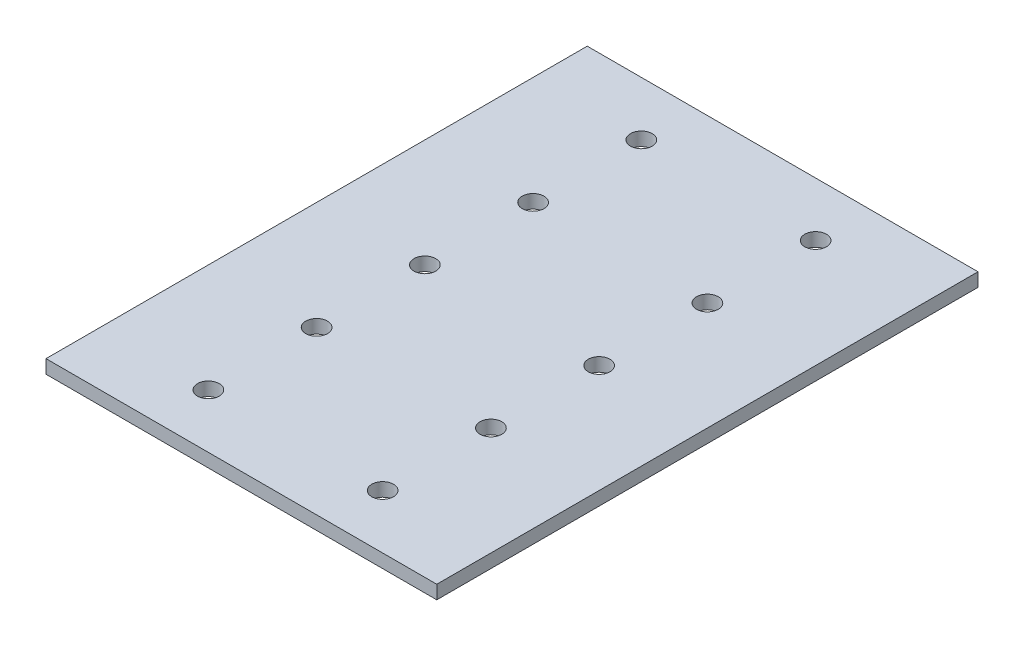
ISO-10303-21;
HEADER;
FILE_DESCRIPTION(('STEP AP214'),'2;1');
FILE_NAME('part.step','',(''),(''),'','','');
FILE_SCHEMA(('AUTOMOTIVE_DESIGN { 1 0 10303 214 1 1 1 1 }'));
ENDSEC;
DATA;
#1=APPLICATION_CONTEXT('core data for automotive mechanical design processes');
#2=APPLICATION_PROTOCOL_DEFINITION('international standard','automotive_design',2000,#1);
#3=PRODUCT_CONTEXT('',#1,'mechanical');
#4=PRODUCT('Part','Part','',(#3));
#5=PRODUCT_RELATED_PRODUCT_CATEGORY('part','',(#4));
#6=PRODUCT_DEFINITION_FORMATION('','',#4);
#7=PRODUCT_DEFINITION_CONTEXT('part definition',#1,'design');
#8=PRODUCT_DEFINITION('design','',#6,#7);
#9=PRODUCT_DEFINITION_SHAPE('','',#8);
#10=(LENGTH_UNIT() NAMED_UNIT(*) SI_UNIT(.MILLI.,.METRE.));
#11=(NAMED_UNIT(*) PLANE_ANGLE_UNIT() SI_UNIT($,.RADIAN.));
#12=(NAMED_UNIT(*) SI_UNIT($,.STERADIAN.) SOLID_ANGLE_UNIT());
#13=UNCERTAINTY_MEASURE_WITH_UNIT(LENGTH_MEASURE(1.E-05),#10,'distance_accuracy_value','');
#14=(GEOMETRIC_REPRESENTATION_CONTEXT(3) GLOBAL_UNCERTAINTY_ASSIGNED_CONTEXT((#13)) GLOBAL_UNIT_ASSIGNED_CONTEXT((#10,
#11,#12)) REPRESENTATION_CONTEXT('',''));
#15=CARTESIAN_POINT('',(0.,0.,0.));
#16=DIRECTION('',(0.,0.,1.));
#17=DIRECTION('',(1.,0.,0.));
#18=AXIS2_PLACEMENT_3D('',#15,#16,#17);
#19=CARTESIAN_POINT('',(66.294,0.,-114.3));
#20=DIRECTION('',(0.,1.,0.));
#21=DIRECTION('',(0.,0.,1.));
#22=AXIS2_PLACEMENT_3D('',#19,#20,#21);
#23=CYLINDRICAL_SURFACE('',#22,2.55270000000001);
#24=CARTESIAN_POINT('',(66.294,0.,-114.3));
#25=DIRECTION('',(0.,1.,0.));
#26=DIRECTION('',(0.,0.,1.));
#27=AXIS2_PLACEMENT_3D('',#24,#25,#26);
#28=CIRCLE('',#27,2.55270000000001);
#29=CARTESIAN_POINT('',(66.294,0.,-111.7473));
#30=VERTEX_POINT('',#29);
#31=EDGE_CURVE('E47',#30,#30,#28,.T.);
#32=ORIENTED_EDGE('',*,*,#31,.F.);
#33=EDGE_LOOP('',(#32));
#34=FACE_BOUND('',#33,.T.);
#35=CARTESIAN_POINT('',(66.294,3.175,-114.3));
#36=DIRECTION('',(0.,1.,0.));
#37=DIRECTION('',(0.,0.,1.));
#38=AXIS2_PLACEMENT_3D('',#35,#36,#37);
#39=CIRCLE('',#38,2.55270000000001);
#40=CARTESIAN_POINT('',(66.294,3.175,-111.7473));
#41=VERTEX_POINT('',#40);
#42=EDGE_CURVE('E11',#41,#41,#39,.T.);
#43=ORIENTED_EDGE('',*,*,#42,.T.);
#44=EDGE_LOOP('',(#43));
#45=FACE_BOUND('',#44,.T.);
#46=ADVANCED_FACE('F39',(#34,#45),#23,.F.);
#47=CARTESIAN_POINT('',(66.294,0.,-88.9));
#48=DIRECTION('',(0.,1.,0.));
#49=DIRECTION('',(0.,0.,1.));
#50=AXIS2_PLACEMENT_3D('',#47,#48,#49);
#51=CYLINDRICAL_SURFACE('',#50,2.55270000000001);
#52=CARTESIAN_POINT('',(66.294,0.,-88.9));
#53=DIRECTION('',(0.,1.,0.));
#54=DIRECTION('',(0.,0.,1.));
#55=AXIS2_PLACEMENT_3D('',#52,#53,#54);
#56=CIRCLE('',#55,2.55270000000001);
#57=CARTESIAN_POINT('',(66.294,0.,-86.3473));
#58=VERTEX_POINT('',#57);
#59=EDGE_CURVE('E141',#58,#58,#56,.T.);
#60=ORIENTED_EDGE('',*,*,#59,.F.);
#61=EDGE_LOOP('',(#60));
#62=FACE_BOUND('',#61,.T.);
#63=CARTESIAN_POINT('',(66.294,3.175,-88.9));
#64=DIRECTION('',(0.,1.,0.));
#65=DIRECTION('',(0.,0.,1.));
#66=AXIS2_PLACEMENT_3D('',#63,#64,#65);
#67=CIRCLE('',#66,2.55270000000001);
#68=CARTESIAN_POINT('',(66.294,3.175,-86.3473));
#69=VERTEX_POINT('',#68);
#70=EDGE_CURVE('E144',#69,#69,#67,.T.);
#71=ORIENTED_EDGE('',*,*,#70,.T.);
#72=EDGE_LOOP('',(#71));
#73=FACE_BOUND('',#72,.T.);
#74=ADVANCED_FACE('F153',(#62,#73),#51,.F.);
#75=CARTESIAN_POINT('',(66.294,0.,-63.5));
#76=DIRECTION('',(0.,1.,0.));
#77=DIRECTION('',(0.,0.,1.));
#78=AXIS2_PLACEMENT_3D('',#75,#76,#77);
#79=CYLINDRICAL_SURFACE('',#78,2.55270000000001);
#80=CARTESIAN_POINT('',(66.294,0.,-63.5));
#81=DIRECTION('',(0.,1.,0.));
#82=DIRECTION('',(0.,0.,1.));
#83=AXIS2_PLACEMENT_3D('',#80,#81,#82);
#84=CIRCLE('',#83,2.55270000000001);
#85=CARTESIAN_POINT('',(66.294,0.,-60.9473));
#86=VERTEX_POINT('',#85);
#87=EDGE_CURVE('E135',#86,#86,#84,.T.);
#88=ORIENTED_EDGE('',*,*,#87,.F.);
#89=EDGE_LOOP('',(#88));
#90=FACE_BOUND('',#89,.T.);
#91=CARTESIAN_POINT('',(66.294,3.175,-63.5));
#92=DIRECTION('',(0.,1.,0.));
#93=DIRECTION('',(0.,0.,1.));
#94=AXIS2_PLACEMENT_3D('',#91,#92,#93);
#95=CIRCLE('',#94,2.55270000000001);
#96=CARTESIAN_POINT('',(66.294,3.175,-60.9473));
#97=VERTEX_POINT('',#96);
#98=EDGE_CURVE('E138',#97,#97,#95,.T.);
#99=ORIENTED_EDGE('',*,*,#98,.T.);
#100=EDGE_LOOP('',(#99));
#101=FACE_BOUND('',#100,.T.);
#102=ADVANCED_FACE('F192',(#90,#101),#79,.F.);
#103=CARTESIAN_POINT('',(25.4,0.,-114.3));
#104=DIRECTION('',(0.,1.,0.));
#105=DIRECTION('',(0.,0.,1.));
#106=AXIS2_PLACEMENT_3D('',#103,#104,#105);
#107=CYLINDRICAL_SURFACE('',#106,2.55269999999993);
#108=CARTESIAN_POINT('',(25.4,0.,-114.3));
#109=DIRECTION('',(0.,1.,0.));
#110=DIRECTION('',(0.,0.,1.));
#111=AXIS2_PLACEMENT_3D('',#108,#109,#110);
#112=CIRCLE('',#111,2.55269999999993);
#113=CARTESIAN_POINT('',(25.4,0.,-111.7473));
#114=VERTEX_POINT('',#113);
#115=EDGE_CURVE('E129',#114,#114,#112,.T.);
#116=ORIENTED_EDGE('',*,*,#115,.F.);
#117=EDGE_LOOP('',(#116));
#118=FACE_BOUND('',#117,.T.);
#119=CARTESIAN_POINT('',(25.4,3.175,-114.3));
#120=DIRECTION('',(0.,1.,0.));
#121=DIRECTION('',(0.,0.,1.));
#122=AXIS2_PLACEMENT_3D('',#119,#120,#121);
#123=CIRCLE('',#122,2.55269999999993);
#124=CARTESIAN_POINT('',(25.4,3.175,-111.7473));
#125=VERTEX_POINT('',#124);
#126=EDGE_CURVE('E132',#125,#125,#123,.T.);
#127=ORIENTED_EDGE('',*,*,#126,.T.);
#128=EDGE_LOOP('',(#127));
#129=FACE_BOUND('',#128,.T.);
#130=ADVANCED_FACE('F188',(#118,#129),#107,.F.);
#131=CARTESIAN_POINT('',(25.4,0.,-88.9));
#132=DIRECTION('',(0.,1.,0.));
#133=DIRECTION('',(0.,0.,1.));
#134=AXIS2_PLACEMENT_3D('',#131,#132,#133);
#135=CYLINDRICAL_SURFACE('',#134,2.55269999999993);
#136=CARTESIAN_POINT('',(25.4,0.,-88.9));
#137=DIRECTION('',(0.,1.,0.));
#138=DIRECTION('',(0.,0.,1.));
#139=AXIS2_PLACEMENT_3D('',#136,#137,#138);
#140=CIRCLE('',#139,2.55269999999993);
#141=CARTESIAN_POINT('',(25.4,0.,-86.3473000000001));
#142=VERTEX_POINT('',#141);
#143=EDGE_CURVE('E123',#142,#142,#140,.T.);
#144=ORIENTED_EDGE('',*,*,#143,.F.);
#145=EDGE_LOOP('',(#144));
#146=FACE_BOUND('',#145,.T.);
#147=CARTESIAN_POINT('',(25.4,3.175,-88.9));
#148=DIRECTION('',(0.,1.,0.));
#149=DIRECTION('',(0.,0.,1.));
#150=AXIS2_PLACEMENT_3D('',#147,#148,#149);
#151=CIRCLE('',#150,2.55269999999993);
#152=CARTESIAN_POINT('',(25.4,3.175,-86.3473000000001));
#153=VERTEX_POINT('',#152);
#154=EDGE_CURVE('E126',#153,#153,#151,.T.);
#155=ORIENTED_EDGE('',*,*,#154,.T.);
#156=EDGE_LOOP('',(#155));
#157=FACE_BOUND('',#156,.T.);
#158=ADVANCED_FACE('F184',(#146,#157),#135,.F.);
#159=CARTESIAN_POINT('',(25.4,0.,-63.5));
#160=DIRECTION('',(0.,1.,0.));
#161=DIRECTION('',(0.,0.,1.));
#162=AXIS2_PLACEMENT_3D('',#159,#160,#161);
#163=CYLINDRICAL_SURFACE('',#162,2.55269999999993);
#164=CARTESIAN_POINT('',(25.4,0.,-63.5));
#165=DIRECTION('',(0.,1.,0.));
#166=DIRECTION('',(0.,0.,1.));
#167=AXIS2_PLACEMENT_3D('',#164,#165,#166);
#168=CIRCLE('',#167,2.55269999999993);
#169=CARTESIAN_POINT('',(25.4,0.,-60.9473000000001));
#170=VERTEX_POINT('',#169);
#171=EDGE_CURVE('E117',#170,#170,#168,.T.);
#172=ORIENTED_EDGE('',*,*,#171,.F.);
#173=EDGE_LOOP('',(#172));
#174=FACE_BOUND('',#173,.T.);
#175=CARTESIAN_POINT('',(25.4,3.175,-63.5));
#176=DIRECTION('',(0.,1.,0.));
#177=DIRECTION('',(0.,0.,1.));
#178=AXIS2_PLACEMENT_3D('',#175,#176,#177);
#179=CIRCLE('',#178,2.55269999999993);
#180=CARTESIAN_POINT('',(25.4,3.175,-60.9473000000001));
#181=VERTEX_POINT('',#180);
#182=EDGE_CURVE('E120',#181,#181,#179,.T.);
#183=ORIENTED_EDGE('',*,*,#182,.T.);
#184=EDGE_LOOP('',(#183));
#185=FACE_BOUND('',#184,.T.);
#186=ADVANCED_FACE('F180',(#174,#185),#163,.F.);
#187=CARTESIAN_POINT('',(0.,3.175,0.));
#188=DIRECTION('',(1.,0.,0.));
#189=DIRECTION('',(0.,0.,-1.));
#190=AXIS2_PLACEMENT_3D('',#187,#188,#189);
#191=PLANE('',#190);
#192=DIRECTION('',(0.,0.,1.));
#193=VECTOR('',#192,1.);
#194=CARTESIAN_POINT('',(0.,0.,0.));
#195=LINE('',#194,#193);
#196=CARTESIAN_POINT('',(0.,0.,-127.));
#197=VERTEX_POINT('',#196);
#198=CARTESIAN_POINT('',(0.,0.,0.));
#199=VERTEX_POINT('',#198);
#200=EDGE_CURVE('E107',#197,#199,#195,.T.);
#201=ORIENTED_EDGE('',*,*,#200,.T.);
#202=DIRECTION('',(0.,-1.,0.));
#203=VECTOR('',#202,1.);
#204=CARTESIAN_POINT('',(0.,3.175,0.));
#205=LINE('',#204,#203);
#206=CARTESIAN_POINT('',(0.,3.175,0.));
#207=VERTEX_POINT('',#206);
#208=EDGE_CURVE('E98',#207,#199,#205,.T.);
#209=ORIENTED_EDGE('',*,*,#208,.F.);
#210=DIRECTION('',(0.,0.,1.));
#211=VECTOR('',#210,1.);
#212=CARTESIAN_POINT('',(0.,3.175,0.));
#213=LINE('',#212,#211);
#214=CARTESIAN_POINT('',(0.,3.175,-127.));
#215=VERTEX_POINT('',#214);
#216=EDGE_CURVE('E92',#215,#207,#213,.T.);
#217=ORIENTED_EDGE('',*,*,#216,.F.);
#218=DIRECTION('',(0.,-1.,0.));
#219=VECTOR('',#218,1.);
#220=CARTESIAN_POINT('',(0.,3.175,-127.));
#221=LINE('',#220,#219);
#222=EDGE_CURVE('E103',#215,#197,#221,.T.);
#223=ORIENTED_EDGE('',*,*,#222,.T.);
#224=EDGE_LOOP('',(#201,#209,#217,#223));
#225=FACE_BOUND('',#224,.T.);
#226=ADVANCED_FACE('F177',(#225),#191,.F.);
#227=CARTESIAN_POINT('',(0.,3.175,0.));
#228=DIRECTION('',(0.,0.,-1.));
#229=DIRECTION('',(-1.,0.,0.));
#230=AXIS2_PLACEMENT_3D('',#227,#228,#229);
#231=PLANE('',#230);
#232=DIRECTION('',(1.,0.,0.));
#233=VECTOR('',#232,1.);
#234=CARTESIAN_POINT('',(0.,0.,0.));
#235=LINE('',#234,#233);
#236=CARTESIAN_POINT('',(91.694,0.,0.));
#237=VERTEX_POINT('',#236);
#238=EDGE_CURVE('E97',#199,#237,#235,.T.);
#239=ORIENTED_EDGE('',*,*,#238,.T.);
#240=DIRECTION('',(0.,-1.,0.));
#241=VECTOR('',#240,1.);
#242=CARTESIAN_POINT('',(91.694,3.175,0.));
#243=LINE('',#242,#241);
#244=CARTESIAN_POINT('',(91.694,3.175,0.));
#245=VERTEX_POINT('',#244);
#246=EDGE_CURVE('E95',#245,#237,#243,.T.);
#247=ORIENTED_EDGE('',*,*,#246,.F.);
#248=DIRECTION('',(1.,0.,0.));
#249=VECTOR('',#248,1.);
#250=CARTESIAN_POINT('',(0.,3.175,0.));
#251=LINE('',#250,#249);
#252=EDGE_CURVE('E86',#207,#245,#251,.T.);
#253=ORIENTED_EDGE('',*,*,#252,.F.);
#254=ORIENTED_EDGE('',*,*,#208,.T.);
#255=EDGE_LOOP('',(#239,#247,#253,#254));
#256=FACE_BOUND('',#255,.T.);
#257=ADVANCED_FACE('F96',(#256),#231,.F.);
#258=CARTESIAN_POINT('',(91.694,3.175,0.));
#259=DIRECTION('',(-1.,0.,0.));
#260=DIRECTION('',(0.,0.,1.));
#261=AXIS2_PLACEMENT_3D('',#258,#259,#260);
#262=PLANE('',#261);
#263=DIRECTION('',(0.,0.,-1.));
#264=VECTOR('',#263,1.);
#265=CARTESIAN_POINT('',(91.694,0.,0.));
#266=LINE('',#265,#264);
#267=CARTESIAN_POINT('',(91.694,0.,-127.));
#268=VERTEX_POINT('',#267);
#269=EDGE_CURVE('E72',#237,#268,#266,.T.);
#270=ORIENTED_EDGE('',*,*,#269,.T.);
#271=DIRECTION('',(0.,-1.,0.));
#272=VECTOR('',#271,1.);
#273=CARTESIAN_POINT('',(91.694,3.175,-127.));
#274=LINE('',#273,#272);
#275=CARTESIAN_POINT('',(91.694,3.175,-127.));
#276=VERTEX_POINT('',#275);
#277=EDGE_CURVE('E99',#276,#268,#274,.T.);
#278=ORIENTED_EDGE('',*,*,#277,.F.);
#279=DIRECTION('',(0.,0.,-1.));
#280=VECTOR('',#279,1.);
#281=CARTESIAN_POINT('',(91.694,3.175,0.));
#282=LINE('',#281,#280);
#283=EDGE_CURVE('E90',#245,#276,#282,.T.);
#284=ORIENTED_EDGE('',*,*,#283,.F.);
#285=ORIENTED_EDGE('',*,*,#246,.T.);
#286=EDGE_LOOP('',(#270,#278,#284,#285));
#287=FACE_BOUND('',#286,.T.);
#288=ADVANCED_FACE('F101',(#287),#262,.F.);
#289=CARTESIAN_POINT('',(0.,3.175,-127.));
#290=DIRECTION('',(0.,0.,1.));
#291=DIRECTION('',(1.,0.,0.));
#292=AXIS2_PLACEMENT_3D('',#289,#290,#291);
#293=PLANE('',#292);
#294=DIRECTION('',(-1.,0.,0.));
#295=VECTOR('',#294,1.);
#296=CARTESIAN_POINT('',(0.,0.,-127.));
#297=LINE('',#296,#295);
#298=EDGE_CURVE('E78',#268,#197,#297,.T.);
#299=ORIENTED_EDGE('',*,*,#298,.T.);
#300=ORIENTED_EDGE('',*,*,#222,.F.);
#301=DIRECTION('',(-1.,0.,0.));
#302=VECTOR('',#301,1.);
#303=CARTESIAN_POINT('',(0.,3.175,-127.));
#304=LINE('',#303,#302);
#305=EDGE_CURVE('E55',#276,#215,#304,.T.);
#306=ORIENTED_EDGE('',*,*,#305,.F.);
#307=ORIENTED_EDGE('',*,*,#277,.T.);
#308=EDGE_LOOP('',(#299,#300,#306,#307));
#309=FACE_BOUND('',#308,.T.);
#310=ADVANCED_FACE('F157',(#309),#293,.F.);
#311=CARTESIAN_POINT('',(0.,3.175,0.));
#312=DIRECTION('',(0.,-1.,0.));
#313=DIRECTION('',(0.,0.,-1.));
#314=AXIS2_PLACEMENT_3D('',#311,#312,#313);
#315=PLANE('',#314);
#316=CARTESIAN_POINT('',(66.294,3.175,-38.1));
#317=DIRECTION('',(0.,1.,0.));
#318=DIRECTION('',(0.,0.,1.));
#319=AXIS2_PLACEMENT_3D('',#316,#317,#318);
#320=CIRCLE('',#319,2.55270000000001);
#321=CARTESIAN_POINT('',(66.294,3.175,-35.5473));
#322=VERTEX_POINT('',#321);
#323=EDGE_CURVE('E347',#322,#322,#320,.T.);
#324=ORIENTED_EDGE('',*,*,#323,.F.);
#325=EDGE_LOOP('',(#324));
#326=FACE_BOUND('',#325,.T.);
#327=CARTESIAN_POINT('',(66.294,3.175,-12.7));
#328=DIRECTION('',(0.,1.,0.));
#329=DIRECTION('',(0.,0.,1.));
#330=AXIS2_PLACEMENT_3D('',#327,#328,#329);
#331=CIRCLE('',#330,2.55270000000001);
#332=CARTESIAN_POINT('',(66.294,3.175,-10.1473));
#333=VERTEX_POINT('',#332);
#334=EDGE_CURVE('E348',#333,#333,#331,.T.);
#335=ORIENTED_EDGE('',*,*,#334,.F.);
#336=EDGE_LOOP('',(#335));
#337=FACE_BOUND('',#336,.T.);
#338=CARTESIAN_POINT('',(25.4,3.175,-38.1));
#339=DIRECTION('',(0.,1.,0.));
#340=DIRECTION('',(0.,0.,1.));
#341=AXIS2_PLACEMENT_3D('',#338,#339,#340);
#342=CIRCLE('',#341,2.55269999999993);
#343=CARTESIAN_POINT('',(25.4,3.175,-35.5473000000001));
#344=VERTEX_POINT('',#343);
#345=EDGE_CURVE('E360',#344,#344,#342,.T.);
#346=ORIENTED_EDGE('',*,*,#345,.F.);
#347=EDGE_LOOP('',(#346));
#348=FACE_BOUND('',#347,.T.);
#349=CARTESIAN_POINT('',(25.4,3.175,-12.7));
#350=DIRECTION('',(0.,1.,0.));
#351=DIRECTION('',(0.,0.,1.));
#352=AXIS2_PLACEMENT_3D('',#349,#350,#351);
#353=CIRCLE('',#352,2.55269999999993);
#354=CARTESIAN_POINT('',(25.4,3.175,-10.1473000000001));
#355=VERTEX_POINT('',#354);
#356=EDGE_CURVE('E363',#355,#355,#353,.T.);
#357=ORIENTED_EDGE('',*,*,#356,.F.);
#358=EDGE_LOOP('',(#357));
#359=FACE_BOUND('',#358,.T.);
#360=ORIENTED_EDGE('',*,*,#216,.T.);
#361=ORIENTED_EDGE('',*,*,#252,.T.);
#362=ORIENTED_EDGE('',*,*,#283,.T.);
#363=ORIENTED_EDGE('',*,*,#305,.T.);
#364=EDGE_LOOP('',(#360,#361,#362,#363));
#365=FACE_BOUND('',#364,.T.);
#366=ORIENTED_EDGE('',*,*,#182,.F.);
#367=EDGE_LOOP('',(#366));
#368=FACE_BOUND('',#367,.T.);
#369=ORIENTED_EDGE('',*,*,#154,.F.);
#370=EDGE_LOOP('',(#369));
#371=FACE_BOUND('',#370,.T.);
#372=ORIENTED_EDGE('',*,*,#126,.F.);
#373=EDGE_LOOP('',(#372));
#374=FACE_BOUND('',#373,.T.);
#375=ORIENTED_EDGE('',*,*,#98,.F.);
#376=EDGE_LOOP('',(#375));
#377=FACE_BOUND('',#376,.T.);
#378=ORIENTED_EDGE('',*,*,#70,.F.);
#379=EDGE_LOOP('',(#378));
#380=FACE_BOUND('',#379,.T.);
#381=ORIENTED_EDGE('',*,*,#42,.F.);
#382=EDGE_LOOP('',(#381));
#383=FACE_BOUND('',#382,.T.);
#384=ADVANCED_FACE('F87',(#326,#337,#348,#359,#365,#368,#371,#374,#377,#380,#383),#315,.F.);
#385=CARTESIAN_POINT('',(0.,0.,0.));
#386=DIRECTION('',(0.,-1.,0.));
#387=DIRECTION('',(0.,0.,-1.));
#388=AXIS2_PLACEMENT_3D('',#385,#386,#387);
#389=PLANE('',#388);
#390=CARTESIAN_POINT('',(66.294,0.,-38.1));
#391=DIRECTION('',(0.,1.,0.));
#392=DIRECTION('',(0.,0.,1.));
#393=AXIS2_PLACEMENT_3D('',#390,#391,#392);
#394=CIRCLE('',#393,2.55270000000001);
#395=CARTESIAN_POINT('',(66.294,0.,-35.5473));
#396=VERTEX_POINT('',#395);
#397=EDGE_CURVE('E345',#396,#396,#394,.T.);
#398=ORIENTED_EDGE('',*,*,#397,.T.);
#399=EDGE_LOOP('',(#398));
#400=FACE_BOUND('',#399,.T.);
#401=CARTESIAN_POINT('',(66.294,0.,-12.7));
#402=DIRECTION('',(0.,1.,0.));
#403=DIRECTION('',(0.,0.,1.));
#404=AXIS2_PLACEMENT_3D('',#401,#402,#403);
#405=CIRCLE('',#404,2.55270000000001);
#406=CARTESIAN_POINT('',(66.294,0.,-10.1473));
#407=VERTEX_POINT('',#406);
#408=EDGE_CURVE('E351',#407,#407,#405,.T.);
#409=ORIENTED_EDGE('',*,*,#408,.T.);
#410=EDGE_LOOP('',(#409));
#411=FACE_BOUND('',#410,.T.);
#412=CARTESIAN_POINT('',(25.4,0.,-38.1));
#413=DIRECTION('',(0.,1.,0.));
#414=DIRECTION('',(0.,0.,1.));
#415=AXIS2_PLACEMENT_3D('',#412,#413,#414);
#416=CIRCLE('',#415,2.55269999999993);
#417=CARTESIAN_POINT('',(25.4,0.,-35.5473000000001));
#418=VERTEX_POINT('',#417);
#419=EDGE_CURVE('E356',#418,#418,#416,.T.);
#420=ORIENTED_EDGE('',*,*,#419,.T.);
#421=EDGE_LOOP('',(#420));
#422=FACE_BOUND('',#421,.T.);
#423=CARTESIAN_POINT('',(25.4,0.,-12.7));
#424=DIRECTION('',(0.,1.,0.));
#425=DIRECTION('',(0.,0.,1.));
#426=AXIS2_PLACEMENT_3D('',#423,#424,#425);
#427=CIRCLE('',#426,2.55269999999993);
#428=CARTESIAN_POINT('',(25.4,0.,-10.1473000000001));
#429=VERTEX_POINT('',#428);
#430=EDGE_CURVE('E110',#429,#429,#427,.T.);
#431=ORIENTED_EDGE('',*,*,#430,.T.);
#432=EDGE_LOOP('',(#431));
#433=FACE_BOUND('',#432,.T.);
#434=ORIENTED_EDGE('',*,*,#200,.F.);
#435=ORIENTED_EDGE('',*,*,#298,.F.);
#436=ORIENTED_EDGE('',*,*,#269,.F.);
#437=ORIENTED_EDGE('',*,*,#238,.F.);
#438=EDGE_LOOP('',(#434,#435,#436,#437));
#439=FACE_BOUND('',#438,.T.);
#440=ORIENTED_EDGE('',*,*,#171,.T.);
#441=EDGE_LOOP('',(#440));
#442=FACE_BOUND('',#441,.T.);
#443=ORIENTED_EDGE('',*,*,#143,.T.);
#444=EDGE_LOOP('',(#443));
#445=FACE_BOUND('',#444,.T.);
#446=ORIENTED_EDGE('',*,*,#115,.T.);
#447=EDGE_LOOP('',(#446));
#448=FACE_BOUND('',#447,.T.);
#449=ORIENTED_EDGE('',*,*,#87,.T.);
#450=EDGE_LOOP('',(#449));
#451=FACE_BOUND('',#450,.T.);
#452=ORIENTED_EDGE('',*,*,#59,.T.);
#453=EDGE_LOOP('',(#452));
#454=FACE_BOUND('',#453,.T.);
#455=ORIENTED_EDGE('',*,*,#31,.T.);
#456=EDGE_LOOP('',(#455));
#457=FACE_BOUND('',#456,.T.);
#458=ADVANCED_FACE('F149',(#400,#411,#422,#433,#439,#442,#445,#448,#451,#454,#457),#389,.T.);
#459=CARTESIAN_POINT('',(25.4,0.,-12.7));
#460=DIRECTION('',(0.,1.,0.));
#461=DIRECTION('',(0.,0.,1.));
#462=AXIS2_PLACEMENT_3D('',#459,#460,#461);
#463=CYLINDRICAL_SURFACE('',#462,2.55269999999993);
#464=ORIENTED_EDGE('',*,*,#430,.F.);
#465=EDGE_LOOP('',(#464));
#466=FACE_BOUND('',#465,.T.);
#467=ORIENTED_EDGE('',*,*,#356,.T.);
#468=EDGE_LOOP('',(#467));
#469=FACE_BOUND('',#468,.T.);
#470=ADVANCED_FACE('F164',(#466,#469),#463,.F.);
#471=CARTESIAN_POINT('',(25.4,0.,-38.1));
#472=DIRECTION('',(0.,1.,0.));
#473=DIRECTION('',(0.,0.,1.));
#474=AXIS2_PLACEMENT_3D('',#471,#472,#473);
#475=CYLINDRICAL_SURFACE('',#474,2.55269999999993);
#476=ORIENTED_EDGE('',*,*,#419,.F.);
#477=EDGE_LOOP('',(#476));
#478=FACE_BOUND('',#477,.T.);
#479=ORIENTED_EDGE('',*,*,#345,.T.);
#480=EDGE_LOOP('',(#479));
#481=FACE_BOUND('',#480,.T.);
#482=ADVANCED_FACE('F250',(#478,#481),#475,.F.);
#483=CARTESIAN_POINT('',(66.294,0.,-12.7));
#484=DIRECTION('',(0.,1.,0.));
#485=DIRECTION('',(0.,0.,1.));
#486=AXIS2_PLACEMENT_3D('',#483,#484,#485);
#487=CYLINDRICAL_SURFACE('',#486,2.55270000000001);
#488=ORIENTED_EDGE('',*,*,#408,.F.);
#489=EDGE_LOOP('',(#488));
#490=FACE_BOUND('',#489,.T.);
#491=ORIENTED_EDGE('',*,*,#334,.T.);
#492=EDGE_LOOP('',(#491));
#493=FACE_BOUND('',#492,.T.);
#494=ADVANCED_FACE('F262',(#490,#493),#487,.F.);
#495=CARTESIAN_POINT('',(66.294,0.,-38.1));
#496=DIRECTION('',(0.,1.,0.));
#497=DIRECTION('',(0.,0.,1.));
#498=AXIS2_PLACEMENT_3D('',#495,#496,#497);
#499=CYLINDRICAL_SURFACE('',#498,2.55270000000001);
#500=ORIENTED_EDGE('',*,*,#397,.F.);
#501=EDGE_LOOP('',(#500));
#502=FACE_BOUND('',#501,.T.);
#503=ORIENTED_EDGE('',*,*,#323,.T.);
#504=EDGE_LOOP('',(#503));
#505=FACE_BOUND('',#504,.T.);
#506=ADVANCED_FACE('F269',(#502,#505),#499,.F.);
#507=CLOSED_SHELL('',(#46,#74,#102,#130,#158,#186,#226,#257,#288,#310,#384,#458,#470,#482,#494,#506));
#508=MANIFOLD_SOLID_BREP('B2',#507);
#509=ADVANCED_BREP_SHAPE_REPRESENTATION('',(#18,#508),#14);
#510=SHAPE_DEFINITION_REPRESENTATION(#9,#509);
ENDSEC;
END-ISO-10303-21;
